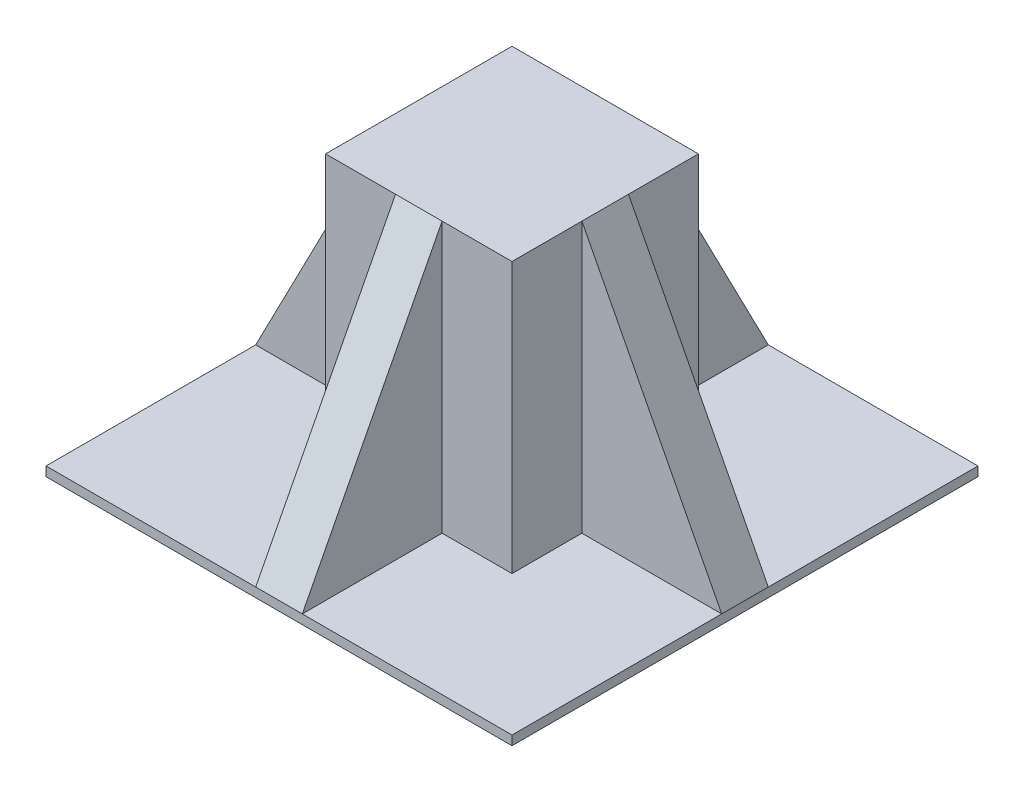
ISO-10303-21;
HEADER;
FILE_DESCRIPTION(('STEP AP214'),'2;1');
FILE_NAME('part.step','',(''),(''),'','','');
FILE_SCHEMA(('AUTOMOTIVE_DESIGN { 1 0 10303 214 1 1 1 1 }'));
ENDSEC;
DATA;
#1=APPLICATION_CONTEXT('core data for automotive mechanical design processes');
#2=APPLICATION_PROTOCOL_DEFINITION('international standard','automotive_design',2000,#1);
#3=PRODUCT_CONTEXT('',#1,'mechanical');
#4=PRODUCT('Part','Part','',(#3));
#5=PRODUCT_RELATED_PRODUCT_CATEGORY('part','',(#4));
#6=PRODUCT_DEFINITION_FORMATION('','',#4);
#7=PRODUCT_DEFINITION_CONTEXT('part definition',#1,'design');
#8=PRODUCT_DEFINITION('design','',#6,#7);
#9=PRODUCT_DEFINITION_SHAPE('','',#8);
#10=(LENGTH_UNIT() NAMED_UNIT(*) SI_UNIT(.MILLI.,.METRE.));
#11=(NAMED_UNIT(*) PLANE_ANGLE_UNIT() SI_UNIT($,.RADIAN.));
#12=(NAMED_UNIT(*) SI_UNIT($,.STERADIAN.) SOLID_ANGLE_UNIT());
#13=UNCERTAINTY_MEASURE_WITH_UNIT(LENGTH_MEASURE(1.E-05),#10,'distance_accuracy_value','');
#14=(GEOMETRIC_REPRESENTATION_CONTEXT(3) GLOBAL_UNCERTAINTY_ASSIGNED_CONTEXT((#13)) GLOBAL_UNIT_ASSIGNED_CONTEXT((#10,
#11,#12)) REPRESENTATION_CONTEXT('',''));
#15=CARTESIAN_POINT('',(0.,0.,0.));
#16=DIRECTION('',(0.,0.,1.));
#17=DIRECTION('',(1.,0.,0.));
#18=AXIS2_PLACEMENT_3D('',#15,#16,#17);
#19=CARTESIAN_POINT('',(0.,2.,0.));
#20=DIRECTION('',(0.,-1.,0.));
#21=DIRECTION('',(0.,0.,-1.));
#22=AXIS2_PLACEMENT_3D('',#19,#20,#21);
#23=PLANE('',#22);
#24=DIRECTION('',(1.,0.,0.));
#25=VECTOR('',#24,1.);
#26=CARTESIAN_POINT('',(-50.,2.,5.));
#27=LINE('',#26,#25);
#28=CARTESIAN_POINT('',(-50.,2.,5.));
#29=VERTEX_POINT('',#28);
#30=CARTESIAN_POINT('',(-20.,2.,5.));
#31=VERTEX_POINT('',#30);
#32=EDGE_CURVE('E61',#29,#31,#27,.T.);
#33=ORIENTED_EDGE('',*,*,#32,.F.);
#34=DIRECTION('',(0.,0.,1.));
#35=VECTOR('',#34,1.);
#36=CARTESIAN_POINT('',(-50.,2.,50.));
#37=LINE('',#36,#35);
#38=CARTESIAN_POINT('',(-50.,2.,50.));
#39=VERTEX_POINT('',#38);
#40=EDGE_CURVE('E244',#29,#39,#37,.T.);
#41=ORIENTED_EDGE('',*,*,#40,.T.);
#42=DIRECTION('',(1.,0.,0.));
#43=VECTOR('',#42,1.);
#44=CARTESIAN_POINT('',(-50.,2.,50.));
#45=LINE('',#44,#43);
#46=CARTESIAN_POINT('',(-5.,2.,50.));
#47=VERTEX_POINT('',#46);
#48=EDGE_CURVE('E249',#39,#47,#45,.T.);
#49=ORIENTED_EDGE('',*,*,#48,.T.);
#50=DIRECTION('',(0.,0.,-1.));
#51=VECTOR('',#50,1.);
#52=CARTESIAN_POINT('',(-5.,2.,20.));
#53=LINE('',#52,#51);
#54=CARTESIAN_POINT('',(-5.,2.,20.));
#55=VERTEX_POINT('',#54);
#56=EDGE_CURVE('E367',#47,#55,#53,.T.);
#57=ORIENTED_EDGE('',*,*,#56,.T.);
#58=DIRECTION('',(1.,0.,0.));
#59=VECTOR('',#58,1.);
#60=CARTESIAN_POINT('',(-20.,2.,20.));
#61=LINE('',#60,#59);
#62=CARTESIAN_POINT('',(-20.,2.,20.));
#63=VERTEX_POINT('',#62);
#64=EDGE_CURVE('E231',#63,#55,#61,.T.);
#65=ORIENTED_EDGE('',*,*,#64,.F.);
#66=DIRECTION('',(0.,0.,1.));
#67=VECTOR('',#66,1.);
#68=CARTESIAN_POINT('',(-20.,2.,20.));
#69=LINE('',#68,#67);
#70=EDGE_CURVE('E225',#31,#63,#69,.T.);
#71=ORIENTED_EDGE('',*,*,#70,.F.);
#72=EDGE_LOOP('',(#33,#41,#49,#57,#65,#71));
#73=FACE_BOUND('',#72,.T.);
#74=ADVANCED_FACE('F45',(#73),#23,.F.);
#75=DIRECTION('',(1.,0.,0.));
#76=VECTOR('',#75,1.);
#77=CARTESIAN_POINT('',(50.,2.,-5.));
#78=LINE('',#77,#76);
#79=CARTESIAN_POINT('',(20.,2.,-5.));
#80=VERTEX_POINT('',#79);
#81=CARTESIAN_POINT('',(50.,2.,-5.));
#82=VERTEX_POINT('',#81);
#83=EDGE_CURVE('E304',#80,#82,#78,.T.);
#84=ORIENTED_EDGE('',*,*,#83,.T.);
#85=DIRECTION('',(0.,0.,-1.));
#86=VECTOR('',#85,1.);
#87=CARTESIAN_POINT('',(50.,2.,50.));
#88=LINE('',#87,#86);
#89=CARTESIAN_POINT('',(50.,2.,-50.));
#90=VERTEX_POINT('',#89);
#91=EDGE_CURVE('E239',#82,#90,#88,.T.);
#92=ORIENTED_EDGE('',*,*,#91,.T.);
#93=DIRECTION('',(-1.,0.,0.));
#94=VECTOR('',#93,1.);
#95=CARTESIAN_POINT('',(-50.,2.,-50.));
#96=LINE('',#95,#94);
#97=CARTESIAN_POINT('',(5.,2.,-50.));
#98=VERTEX_POINT('',#97);
#99=EDGE_CURVE('E240',#90,#98,#96,.T.);
#100=ORIENTED_EDGE('',*,*,#99,.T.);
#101=DIRECTION('',(0.,0.,-1.));
#102=VECTOR('',#101,1.);
#103=CARTESIAN_POINT('',(5.,2.,-50.));
#104=LINE('',#103,#102);
#105=CARTESIAN_POINT('',(5.,2.,-20.));
#106=VERTEX_POINT('',#105);
#107=EDGE_CURVE('E336',#106,#98,#104,.T.);
#108=ORIENTED_EDGE('',*,*,#107,.F.);
#109=DIRECTION('',(-1.,0.,0.));
#110=VECTOR('',#109,1.);
#111=CARTESIAN_POINT('',(-20.,2.,-20.));
#112=LINE('',#111,#110);
#113=CARTESIAN_POINT('',(20.,2.,-20.));
#114=VERTEX_POINT('',#113);
#115=EDGE_CURVE('E218',#114,#106,#112,.T.);
#116=ORIENTED_EDGE('',*,*,#115,.F.);
#117=DIRECTION('',(0.,0.,-1.));
#118=VECTOR('',#117,1.);
#119=CARTESIAN_POINT('',(20.,2.,20.));
#120=LINE('',#119,#118);
#121=EDGE_CURVE('E214',#80,#114,#120,.T.);
#122=ORIENTED_EDGE('',*,*,#121,.F.);
#123=EDGE_LOOP('',(#84,#92,#100,#108,#116,#122));
#124=FACE_BOUND('',#123,.T.);
#125=ADVANCED_FACE('F434',(#124),#23,.F.);
#126=CARTESIAN_POINT('',(20.,60.,0.));
#127=DIRECTION('',(-1.,0.,0.));
#128=DIRECTION('',(0.,0.,1.));
#129=AXIS2_PLACEMENT_3D('',#126,#127,#128);
#130=PLANE('',#129);
#131=DIRECTION('',(0.,-1.,0.));
#132=VECTOR('',#131,1.);
#133=CARTESIAN_POINT('',(20.,2.,-5.));
#134=LINE('',#133,#132);
#135=CARTESIAN_POINT('',(20.,60.,-5.));
#136=VERTEX_POINT('',#135);
#137=EDGE_CURVE('E431',#136,#80,#134,.T.);
#138=ORIENTED_EDGE('',*,*,#137,.T.);
#139=ORIENTED_EDGE('',*,*,#121,.T.);
#140=DIRECTION('',(0.,-1.,0.));
#141=VECTOR('',#140,1.);
#142=CARTESIAN_POINT('',(20.,60.,-20.));
#143=LINE('',#142,#141);
#144=CARTESIAN_POINT('',(20.,60.,-20.));
#145=VERTEX_POINT('',#144);
#146=EDGE_CURVE('E414',#145,#114,#143,.T.);
#147=ORIENTED_EDGE('',*,*,#146,.F.);
#148=DIRECTION('',(0.,0.,-1.));
#149=VECTOR('',#148,1.);
#150=CARTESIAN_POINT('',(20.,60.,0.));
#151=LINE('',#150,#149);
#152=EDGE_CURVE('E393',#136,#145,#151,.T.);
#153=ORIENTED_EDGE('',*,*,#152,.F.);
#154=EDGE_LOOP('',(#138,#139,#147,#153));
#155=FACE_BOUND('',#154,.T.);
#156=ADVANCED_FACE('F427',(#155),#130,.F.);
#157=CARTESIAN_POINT('',(-20.,60.,0.));
#158=DIRECTION('',(-1.,0.,0.));
#159=DIRECTION('',(0.,0.,1.));
#160=AXIS2_PLACEMENT_3D('',#157,#158,#159);
#161=PLANE('',#160);
#162=DIRECTION('',(0.,0.,-1.));
#163=VECTOR('',#162,1.);
#164=CARTESIAN_POINT('',(-20.,60.,0.));
#165=LINE('',#164,#163);
#166=CARTESIAN_POINT('',(-20.,60.,20.));
#167=VERTEX_POINT('',#166);
#168=CARTESIAN_POINT('',(-20.,60.,5.));
#169=VERTEX_POINT('',#168);
#170=EDGE_CURVE('E403',#167,#169,#165,.T.);
#171=ORIENTED_EDGE('',*,*,#170,.T.);
#172=DIRECTION('',(0.,1.,0.));
#173=VECTOR('',#172,1.);
#174=CARTESIAN_POINT('',(-20.,2.,5.));
#175=LINE('',#174,#173);
#176=EDGE_CURVE('E196',#31,#169,#175,.T.);
#177=ORIENTED_EDGE('',*,*,#176,.F.);
#178=ORIENTED_EDGE('',*,*,#70,.T.);
#179=DIRECTION('',(0.,-1.,0.));
#180=VECTOR('',#179,1.);
#181=CARTESIAN_POINT('',(-20.,60.,20.));
#182=LINE('',#181,#180);
#183=EDGE_CURVE('E407',#167,#63,#182,.T.);
#184=ORIENTED_EDGE('',*,*,#183,.F.);
#185=EDGE_LOOP('',(#171,#177,#178,#184));
#186=FACE_BOUND('',#185,.T.);
#187=ADVANCED_FACE('F465',(#186),#161,.T.);
#188=CARTESIAN_POINT('',(-50.,2.,-50.));
#189=VERTEX_POINT('',#188);
#190=CARTESIAN_POINT('',(-50.,2.,-5.));
#191=VERTEX_POINT('',#190);
#192=EDGE_CURVE('E245',#189,#191,#37,.T.);
#193=ORIENTED_EDGE('',*,*,#192,.T.);
#194=DIRECTION('',(1.,0.,0.));
#195=VECTOR('',#194,1.);
#196=CARTESIAN_POINT('',(-50.,2.,-5.));
#197=LINE('',#196,#195);
#198=CARTESIAN_POINT('',(-20.,2.,-5.));
#199=VERTEX_POINT('',#198);
#200=EDGE_CURVE('E310',#191,#199,#197,.T.);
#201=ORIENTED_EDGE('',*,*,#200,.T.);
#202=CARTESIAN_POINT('',(-20.,2.,-20.));
#203=VERTEX_POINT('',#202);
#204=EDGE_CURVE('E226',#203,#199,#69,.T.);
#205=ORIENTED_EDGE('',*,*,#204,.F.);
#206=CARTESIAN_POINT('',(-5.,2.,-20.));
#207=VERTEX_POINT('',#206);
#208=EDGE_CURVE('E213',#207,#203,#112,.T.);
#209=ORIENTED_EDGE('',*,*,#208,.F.);
#210=DIRECTION('',(0.,0.,-1.));
#211=VECTOR('',#210,1.);
#212=CARTESIAN_POINT('',(-5.,2.,-50.));
#213=LINE('',#212,#211);
#214=CARTESIAN_POINT('',(-5.,2.,-50.));
#215=VERTEX_POINT('',#214);
#216=EDGE_CURVE('E348',#207,#215,#213,.T.);
#217=ORIENTED_EDGE('',*,*,#216,.T.);
#218=EDGE_CURVE('E238',#215,#189,#96,.T.);
#219=ORIENTED_EDGE('',*,*,#218,.T.);
#220=EDGE_LOOP('',(#193,#201,#205,#209,#217,#219));
#221=FACE_BOUND('',#220,.T.);
#222=ADVANCED_FACE('F455',(#221),#23,.F.);
#223=CARTESIAN_POINT('',(0.,60.,20.));
#224=DIRECTION('',(0.,0.,-1.));
#225=DIRECTION('',(-1.,0.,0.));
#226=AXIS2_PLACEMENT_3D('',#223,#224,#225);
#227=PLANE('',#226);
#228=DIRECTION('',(0.,1.,0.));
#229=VECTOR('',#228,1.);
#230=CARTESIAN_POINT('',(5.,60.,20.));
#231=LINE('',#230,#229);
#232=CARTESIAN_POINT('',(5.,2.,20.));
#233=VERTEX_POINT('',#232);
#234=CARTESIAN_POINT('',(5.,60.,20.));
#235=VERTEX_POINT('',#234);
#236=EDGE_CURVE('E337',#233,#235,#231,.T.);
#237=ORIENTED_EDGE('',*,*,#236,.F.);
#238=CARTESIAN_POINT('',(20.,2.,20.));
#239=VERTEX_POINT('',#238);
#240=EDGE_CURVE('E230',#233,#239,#61,.T.);
#241=ORIENTED_EDGE('',*,*,#240,.T.);
#242=DIRECTION('',(0.,-1.,0.));
#243=VECTOR('',#242,1.);
#244=CARTESIAN_POINT('',(20.,60.,20.));
#245=LINE('',#244,#243);
#246=CARTESIAN_POINT('',(20.,60.,20.));
#247=VERTEX_POINT('',#246);
#248=EDGE_CURVE('E211',#247,#239,#245,.T.);
#249=ORIENTED_EDGE('',*,*,#248,.F.);
#250=DIRECTION('',(1.,0.,0.));
#251=VECTOR('',#250,1.);
#252=CARTESIAN_POINT('',(0.,60.,20.));
#253=LINE('',#252,#251);
#254=EDGE_CURVE('E360',#235,#247,#253,.T.);
#255=ORIENTED_EDGE('',*,*,#254,.F.);
#256=EDGE_LOOP('',(#237,#241,#249,#255));
#257=FACE_BOUND('',#256,.T.);
#258=ADVANCED_FACE('F506',(#257),#227,.F.);
#259=CARTESIAN_POINT('',(0.,60.,-20.));
#260=DIRECTION('',(0.,0.,-1.));
#261=DIRECTION('',(-1.,0.,0.));
#262=AXIS2_PLACEMENT_3D('',#259,#260,#261);
#263=PLANE('',#262);
#264=DIRECTION('',(1.,0.,0.));
#265=VECTOR('',#264,1.);
#266=CARTESIAN_POINT('',(0.,60.,-20.));
#267=LINE('',#266,#265);
#268=CARTESIAN_POINT('',(-20.,60.,-20.));
#269=VERTEX_POINT('',#268);
#270=CARTESIAN_POINT('',(-5.,60.,-20.));
#271=VERTEX_POINT('',#270);
#272=EDGE_CURVE('E398',#269,#271,#267,.T.);
#273=ORIENTED_EDGE('',*,*,#272,.T.);
#274=DIRECTION('',(0.,-1.,0.));
#275=VECTOR('',#274,1.);
#276=CARTESIAN_POINT('',(-5.,2.,-20.));
#277=LINE('',#276,#275);
#278=EDGE_CURVE('E345',#271,#207,#277,.T.);
#279=ORIENTED_EDGE('',*,*,#278,.T.);
#280=ORIENTED_EDGE('',*,*,#208,.T.);
#281=DIRECTION('',(0.,-1.,0.));
#282=VECTOR('',#281,1.);
#283=CARTESIAN_POINT('',(-20.,60.,-20.));
#284=LINE('',#283,#282);
#285=EDGE_CURVE('E411',#269,#203,#284,.T.);
#286=ORIENTED_EDGE('',*,*,#285,.F.);
#287=EDGE_LOOP('',(#273,#279,#280,#286));
#288=FACE_BOUND('',#287,.T.);
#289=ADVANCED_FACE('F449',(#288),#263,.T.);
#290=CARTESIAN_POINT('',(50.,2.,50.));
#291=VERTEX_POINT('',#290);
#292=CARTESIAN_POINT('',(50.,2.,5.));
#293=VERTEX_POINT('',#292);
#294=EDGE_CURVE('E206',#291,#293,#88,.T.);
#295=ORIENTED_EDGE('',*,*,#294,.T.);
#296=DIRECTION('',(1.,0.,0.));
#297=VECTOR('',#296,1.);
#298=CARTESIAN_POINT('',(50.,2.,5.));
#299=LINE('',#298,#297);
#300=CARTESIAN_POINT('',(20.,2.,5.));
#301=VERTEX_POINT('',#300);
#302=EDGE_CURVE('E188',#301,#293,#299,.T.);
#303=ORIENTED_EDGE('',*,*,#302,.F.);
#304=EDGE_CURVE('E203',#239,#301,#120,.T.);
#305=ORIENTED_EDGE('',*,*,#304,.F.);
#306=ORIENTED_EDGE('',*,*,#240,.F.);
#307=DIRECTION('',(0.,0.,-1.));
#308=VECTOR('',#307,1.);
#309=CARTESIAN_POINT('',(5.,2.,20.));
#310=LINE('',#309,#308);
#311=CARTESIAN_POINT('',(5.,2.,50.));
#312=VERTEX_POINT('',#311);
#313=EDGE_CURVE('E380',#312,#233,#310,.T.);
#314=ORIENTED_EDGE('',*,*,#313,.F.);
#315=EDGE_CURVE('E248',#312,#291,#45,.T.);
#316=ORIENTED_EDGE('',*,*,#315,.T.);
#317=EDGE_LOOP('',(#295,#303,#305,#306,#314,#316));
#318=FACE_BOUND('',#317,.T.);
#319=ADVANCED_FACE('F201',(#318),#23,.F.);
#320=CARTESIAN_POINT('',(0.,0.,0.));
#321=DIRECTION('',(0.,-1.,0.));
#322=DIRECTION('',(0.,0.,-1.));
#323=AXIS2_PLACEMENT_3D('',#320,#321,#322);
#324=PLANE('',#323);
#325=DIRECTION('',(0.,0.,-1.));
#326=VECTOR('',#325,1.);
#327=CARTESIAN_POINT('',(50.,0.,50.));
#328=LINE('',#327,#326);
#329=CARTESIAN_POINT('',(50.,0.,50.));
#330=VERTEX_POINT('',#329);
#331=CARTESIAN_POINT('',(50.,0.,-50.));
#332=VERTEX_POINT('',#331);
#333=EDGE_CURVE('E235',#330,#332,#328,.T.);
#334=ORIENTED_EDGE('',*,*,#333,.F.);
#335=DIRECTION('',(1.,0.,0.));
#336=VECTOR('',#335,1.);
#337=CARTESIAN_POINT('',(-50.,0.,50.));
#338=LINE('',#337,#336);
#339=CARTESIAN_POINT('',(-50.,0.,50.));
#340=VERTEX_POINT('',#339);
#341=EDGE_CURVE('E263',#340,#330,#338,.T.);
#342=ORIENTED_EDGE('',*,*,#341,.F.);
#343=DIRECTION('',(0.,0.,1.));
#344=VECTOR('',#343,1.);
#345=CARTESIAN_POINT('',(-50.,0.,50.));
#346=LINE('',#345,#344);
#347=CARTESIAN_POINT('',(-50.,0.,-50.));
#348=VERTEX_POINT('',#347);
#349=EDGE_CURVE('E260',#348,#340,#346,.T.);
#350=ORIENTED_EDGE('',*,*,#349,.F.);
#351=DIRECTION('',(-1.,0.,0.));
#352=VECTOR('',#351,1.);
#353=CARTESIAN_POINT('',(-50.,0.,-50.));
#354=LINE('',#353,#352);
#355=EDGE_CURVE('E257',#332,#348,#354,.T.);
#356=ORIENTED_EDGE('',*,*,#355,.F.);
#357=EDGE_LOOP('',(#334,#342,#350,#356));
#358=FACE_BOUND('',#357,.T.);
#359=ADVANCED_FACE('F283',(#358),#324,.T.);
#360=CARTESIAN_POINT('',(50.,2.,50.));
#361=DIRECTION('',(-1.,0.,0.));
#362=DIRECTION('',(0.,0.,1.));
#363=AXIS2_PLACEMENT_3D('',#360,#361,#362);
#364=PLANE('',#363);
#365=ORIENTED_EDGE('',*,*,#333,.T.);
#366=DIRECTION('',(0.,-1.,0.));
#367=VECTOR('',#366,1.);
#368=CARTESIAN_POINT('',(50.,2.,-50.));
#369=LINE('',#368,#367);
#370=EDGE_CURVE('E11',#90,#332,#369,.T.);
#371=ORIENTED_EDGE('',*,*,#370,.F.);
#372=ORIENTED_EDGE('',*,*,#91,.F.);
#373=DIRECTION('',(0.,0.,1.));
#374=VECTOR('',#373,1.);
#375=CARTESIAN_POINT('',(50.,2.,-5.));
#376=LINE('',#375,#374);
#377=EDGE_CURVE('E293',#82,#293,#376,.T.);
#378=ORIENTED_EDGE('',*,*,#377,.T.);
#379=ORIENTED_EDGE('',*,*,#294,.F.);
#380=DIRECTION('',(0.,-1.,0.));
#381=VECTOR('',#380,1.);
#382=CARTESIAN_POINT('',(50.,2.,50.));
#383=LINE('',#382,#381);
#384=EDGE_CURVE('E253',#291,#330,#383,.T.);
#385=ORIENTED_EDGE('',*,*,#384,.T.);
#386=EDGE_LOOP('',(#365,#371,#372,#378,#379,#385));
#387=FACE_BOUND('',#386,.T.);
#388=ADVANCED_FACE('F47',(#387),#364,.F.);
#389=CARTESIAN_POINT('',(-50.,2.,-50.));
#390=DIRECTION('',(0.,0.,1.));
#391=DIRECTION('',(1.,0.,0.));
#392=AXIS2_PLACEMENT_3D('',#389,#390,#391);
#393=PLANE('',#392);
#394=ORIENTED_EDGE('',*,*,#355,.T.);
#395=DIRECTION('',(0.,-1.,0.));
#396=VECTOR('',#395,1.);
#397=CARTESIAN_POINT('',(-50.,2.,-50.));
#398=LINE('',#397,#396);
#399=EDGE_CURVE('E54',#189,#348,#398,.T.);
#400=ORIENTED_EDGE('',*,*,#399,.F.);
#401=ORIENTED_EDGE('',*,*,#218,.F.);
#402=DIRECTION('',(1.,0.,0.));
#403=VECTOR('',#402,1.);
#404=CARTESIAN_POINT('',(-5.,2.,-50.));
#405=LINE('',#404,#403);
#406=EDGE_CURVE('E355',#215,#98,#405,.T.);
#407=ORIENTED_EDGE('',*,*,#406,.T.);
#408=ORIENTED_EDGE('',*,*,#99,.F.);
#409=ORIENTED_EDGE('',*,*,#370,.T.);
#410=EDGE_LOOP('',(#394,#400,#401,#407,#408,#409));
#411=FACE_BOUND('',#410,.T.);
#412=ADVANCED_FACE('F457',(#411),#393,.F.);
#413=CARTESIAN_POINT('',(-50.,2.,50.));
#414=DIRECTION('',(1.,0.,0.));
#415=DIRECTION('',(0.,0.,-1.));
#416=AXIS2_PLACEMENT_3D('',#413,#414,#415);
#417=PLANE('',#416);
#418=ORIENTED_EDGE('',*,*,#349,.T.);
#419=DIRECTION('',(0.,-1.,0.));
#420=VECTOR('',#419,1.);
#421=CARTESIAN_POINT('',(-50.,2.,50.));
#422=LINE('',#421,#420);
#423=EDGE_CURVE('E269',#39,#340,#422,.T.);
#424=ORIENTED_EDGE('',*,*,#423,.F.);
#425=ORIENTED_EDGE('',*,*,#40,.F.);
#426=DIRECTION('',(0.,0.,1.));
#427=VECTOR('',#426,1.);
#428=CARTESIAN_POINT('',(-50.,2.,-5.));
#429=LINE('',#428,#427);
#430=EDGE_CURVE('E68',#191,#29,#429,.T.);
#431=ORIENTED_EDGE('',*,*,#430,.F.);
#432=ORIENTED_EDGE('',*,*,#192,.F.);
#433=ORIENTED_EDGE('',*,*,#399,.T.);
#434=EDGE_LOOP('',(#418,#424,#425,#431,#432,#433));
#435=FACE_BOUND('',#434,.T.);
#436=ADVANCED_FACE('F276',(#435),#417,.F.);
#437=CARTESIAN_POINT('',(-50.,2.,50.));
#438=DIRECTION('',(0.,0.,-1.));
#439=DIRECTION('',(-1.,0.,0.));
#440=AXIS2_PLACEMENT_3D('',#437,#438,#439);
#441=PLANE('',#440);
#442=ORIENTED_EDGE('',*,*,#341,.T.);
#443=ORIENTED_EDGE('',*,*,#384,.F.);
#444=ORIENTED_EDGE('',*,*,#315,.F.);
#445=DIRECTION('',(1.,0.,0.));
#446=VECTOR('',#445,1.);
#447=CARTESIAN_POINT('',(-5.,2.,50.));
#448=LINE('',#447,#446);
#449=EDGE_CURVE('E302',#47,#312,#448,.T.);
#450=ORIENTED_EDGE('',*,*,#449,.F.);
#451=ORIENTED_EDGE('',*,*,#48,.F.);
#452=ORIENTED_EDGE('',*,*,#423,.T.);
#453=EDGE_LOOP('',(#442,#443,#444,#450,#451,#452));
#454=FACE_BOUND('',#453,.T.);
#455=ADVANCED_FACE('F286',(#454),#441,.F.);
#456=ORIENTED_EDGE('',*,*,#64,.T.);
#457=DIRECTION('',(0.,1.,0.));
#458=VECTOR('',#457,1.);
#459=CARTESIAN_POINT('',(-5.,60.,20.));
#460=LINE('',#459,#458);
#461=CARTESIAN_POINT('',(-5.,60.,20.));
#462=VERTEX_POINT('',#461);
#463=EDGE_CURVE('E376',#55,#462,#460,.T.);
#464=ORIENTED_EDGE('',*,*,#463,.T.);
#465=EDGE_CURVE('E389',#167,#462,#253,.T.);
#466=ORIENTED_EDGE('',*,*,#465,.F.);
#467=ORIENTED_EDGE('',*,*,#183,.T.);
#468=EDGE_LOOP('',(#456,#464,#466,#467));
#469=FACE_BOUND('',#468,.T.);
#470=ADVANCED_FACE('F469',(#469),#227,.F.);
#471=DIRECTION('',(0.,-1.,0.));
#472=VECTOR('',#471,1.);
#473=CARTESIAN_POINT('',(5.,2.,-20.));
#474=LINE('',#473,#472);
#475=CARTESIAN_POINT('',(5.,60.,-20.));
#476=VERTEX_POINT('',#475);
#477=EDGE_CURVE('E332',#476,#106,#474,.T.);
#478=ORIENTED_EDGE('',*,*,#477,.F.);
#479=EDGE_CURVE('E397',#476,#145,#267,.T.);
#480=ORIENTED_EDGE('',*,*,#479,.T.);
#481=ORIENTED_EDGE('',*,*,#146,.T.);
#482=ORIENTED_EDGE('',*,*,#115,.T.);
#483=EDGE_LOOP('',(#478,#480,#481,#482));
#484=FACE_BOUND('',#483,.T.);
#485=ADVANCED_FACE('F422',(#484),#263,.T.);
#486=ORIENTED_EDGE('',*,*,#304,.T.);
#487=DIRECTION('',(0.,-1.,0.));
#488=VECTOR('',#487,1.);
#489=CARTESIAN_POINT('',(20.,2.,5.));
#490=LINE('',#489,#488);
#491=CARTESIAN_POINT('',(20.,60.,5.));
#492=VERTEX_POINT('',#491);
#493=EDGE_CURVE('E185',#492,#301,#490,.T.);
#494=ORIENTED_EDGE('',*,*,#493,.F.);
#495=EDGE_CURVE('E394',#247,#492,#151,.T.);
#496=ORIENTED_EDGE('',*,*,#495,.F.);
#497=ORIENTED_EDGE('',*,*,#248,.T.);
#498=EDGE_LOOP('',(#486,#494,#496,#497));
#499=FACE_BOUND('',#498,.T.);
#500=ADVANCED_FACE('F209',(#499),#130,.F.);
#501=DIRECTION('',(0.,1.,0.));
#502=VECTOR('',#501,1.);
#503=CARTESIAN_POINT('',(-20.,2.,-5.));
#504=LINE('',#503,#502);
#505=CARTESIAN_POINT('',(-20.,60.,-5.));
#506=VERTEX_POINT('',#505);
#507=EDGE_CURVE('E319',#199,#506,#504,.T.);
#508=ORIENTED_EDGE('',*,*,#507,.T.);
#509=EDGE_CURVE('E402',#506,#269,#165,.T.);
#510=ORIENTED_EDGE('',*,*,#509,.T.);
#511=ORIENTED_EDGE('',*,*,#285,.T.);
#512=ORIENTED_EDGE('',*,*,#204,.T.);
#513=EDGE_LOOP('',(#508,#510,#511,#512));
#514=FACE_BOUND('',#513,.T.);
#515=ADVANCED_FACE('F514',(#514),#161,.T.);
#516=CARTESIAN_POINT('',(0.,60.,0.));
#517=DIRECTION('',(0.,1.,0.));
#518=DIRECTION('',(0.,0.,1.));
#519=AXIS2_PLACEMENT_3D('',#516,#517,#518);
#520=PLANE('',#519);
#521=ORIENTED_EDGE('',*,*,#465,.T.);
#522=DIRECTION('',(1.,0.,0.));
#523=VECTOR('',#522,1.);
#524=CARTESIAN_POINT('',(-5.,60.,20.));
#525=LINE('',#524,#523);
#526=EDGE_CURVE('E363',#462,#235,#525,.T.);
#527=ORIENTED_EDGE('',*,*,#526,.T.);
#528=ORIENTED_EDGE('',*,*,#254,.T.);
#529=ORIENTED_EDGE('',*,*,#495,.T.);
#530=DIRECTION('',(0.,0.,1.));
#531=VECTOR('',#530,1.);
#532=CARTESIAN_POINT('',(20.,60.,-5.));
#533=LINE('',#532,#531);
#534=EDGE_CURVE('E297',#136,#492,#533,.T.);
#535=ORIENTED_EDGE('',*,*,#534,.F.);
#536=ORIENTED_EDGE('',*,*,#152,.T.);
#537=ORIENTED_EDGE('',*,*,#479,.F.);
#538=DIRECTION('',(1.,0.,0.));
#539=VECTOR('',#538,1.);
#540=CARTESIAN_POINT('',(-5.,60.,-20.));
#541=LINE('',#540,#539);
#542=EDGE_CURVE('E356',#271,#476,#541,.T.);
#543=ORIENTED_EDGE('',*,*,#542,.F.);
#544=ORIENTED_EDGE('',*,*,#272,.F.);
#545=ORIENTED_EDGE('',*,*,#509,.F.);
#546=DIRECTION('',(0.,0.,1.));
#547=VECTOR('',#546,1.);
#548=CARTESIAN_POINT('',(-20.,60.,-5.));
#549=LINE('',#548,#547);
#550=EDGE_CURVE('E307',#506,#169,#549,.T.);
#551=ORIENTED_EDGE('',*,*,#550,.T.);
#552=ORIENTED_EDGE('',*,*,#170,.F.);
#553=EDGE_LOOP('',(#521,#527,#528,#529,#535,#536,#537,#543,#544,#545,#551,#552));
#554=FACE_BOUND('',#553,.T.);
#555=ADVANCED_FACE('F445',(#554),#520,.T.);
#556=CARTESIAN_POINT('',(-5.,2.,50.));
#557=DIRECTION('',(0.,0.459422918873767,0.888217643155949));
#558=DIRECTION('',(0.,-0.888217643155949,0.459422918873767));
#559=AXIS2_PLACEMENT_3D('',#556,#557,#558);
#560=PLANE('',#559);
#561=ORIENTED_EDGE('',*,*,#449,.T.);
#562=DIRECTION('',(0.,-0.888217643155949,0.459422918873767));
#563=VECTOR('',#562,1.);
#564=CARTESIAN_POINT('',(5.,2.,50.));
#565=LINE('',#564,#563);
#566=EDGE_CURVE('E383',#235,#312,#565,.T.);
#567=ORIENTED_EDGE('',*,*,#566,.F.);
#568=ORIENTED_EDGE('',*,*,#526,.F.);
#569=DIRECTION('',(0.,-0.888217643155949,0.459422918873767));
#570=VECTOR('',#569,1.);
#571=CARTESIAN_POINT('',(-5.,2.,50.));
#572=LINE('',#571,#570);
#573=EDGE_CURVE('E373',#462,#47,#572,.T.);
#574=ORIENTED_EDGE('',*,*,#573,.T.);
#575=EDGE_LOOP('',(#561,#567,#568,#574));
#576=FACE_BOUND('',#575,.T.);
#577=ADVANCED_FACE('F526',(#576),#560,.T.);
#578=CARTESIAN_POINT('',(-5.,0.,0.));
#579=DIRECTION('',(-1.,0.,0.));
#580=DIRECTION('',(0.,0.,1.));
#581=AXIS2_PLACEMENT_3D('',#578,#579,#580);
#582=PLANE('',#581);
#583=ORIENTED_EDGE('',*,*,#463,.F.);
#584=ORIENTED_EDGE('',*,*,#56,.F.);
#585=ORIENTED_EDGE('',*,*,#573,.F.);
#586=EDGE_LOOP('',(#583,#584,#585));
#587=FACE_BOUND('',#586,.T.);
#588=ADVANCED_FACE('F544',(#587),#582,.T.);
#589=CARTESIAN_POINT('',(5.,0.,0.));
#590=DIRECTION('',(-1.,0.,0.));
#591=DIRECTION('',(0.,0.,1.));
#592=AXIS2_PLACEMENT_3D('',#589,#590,#591);
#593=PLANE('',#592);
#594=ORIENTED_EDGE('',*,*,#236,.T.);
#595=ORIENTED_EDGE('',*,*,#566,.T.);
#596=ORIENTED_EDGE('',*,*,#313,.T.);
#597=EDGE_LOOP('',(#594,#595,#596));
#598=FACE_BOUND('',#597,.T.);
#599=ADVANCED_FACE('F542',(#598),#593,.F.);
#600=CARTESIAN_POINT('',(-5.,60.,-20.));
#601=DIRECTION('',(0.,0.459422918873767,-0.888217643155949));
#602=DIRECTION('',(0.,0.888217643155949,0.459422918873767));
#603=AXIS2_PLACEMENT_3D('',#600,#601,#602);
#604=PLANE('',#603);
#605=ORIENTED_EDGE('',*,*,#542,.T.);
#606=DIRECTION('',(0.,0.888217643155949,0.459422918873767));
#607=VECTOR('',#606,1.);
#608=CARTESIAN_POINT('',(5.,60.,-20.));
#609=LINE('',#608,#607);
#610=EDGE_CURVE('E341',#98,#476,#609,.T.);
#611=ORIENTED_EDGE('',*,*,#610,.F.);
#612=ORIENTED_EDGE('',*,*,#406,.F.);
#613=DIRECTION('',(0.,0.888217643155949,0.459422918873767));
#614=VECTOR('',#613,1.);
#615=CARTESIAN_POINT('',(-5.,60.,-20.));
#616=LINE('',#615,#614);
#617=EDGE_CURVE('E351',#215,#271,#616,.T.);
#618=ORIENTED_EDGE('',*,*,#617,.T.);
#619=EDGE_LOOP('',(#605,#611,#612,#618));
#620=FACE_BOUND('',#619,.T.);
#621=ADVANCED_FACE('F441',(#620),#604,.T.);
#622=CARTESIAN_POINT('',(-5.,0.,0.));
#623=DIRECTION('',(1.,0.,0.));
#624=DIRECTION('',(0.,0.,-1.));
#625=AXIS2_PLACEMENT_3D('',#622,#623,#624);
#626=PLANE('',#625);
#627=ORIENTED_EDGE('',*,*,#278,.F.);
#628=ORIENTED_EDGE('',*,*,#617,.F.);
#629=ORIENTED_EDGE('',*,*,#216,.F.);
#630=EDGE_LOOP('',(#627,#628,#629));
#631=FACE_BOUND('',#630,.T.);
#632=ADVANCED_FACE('F453',(#631),#626,.F.);
#633=CARTESIAN_POINT('',(5.,0.,0.));
#634=DIRECTION('',(1.,0.,0.));
#635=DIRECTION('',(0.,0.,-1.));
#636=AXIS2_PLACEMENT_3D('',#633,#634,#635);
#637=PLANE('',#636);
#638=ORIENTED_EDGE('',*,*,#477,.T.);
#639=ORIENTED_EDGE('',*,*,#107,.T.);
#640=ORIENTED_EDGE('',*,*,#610,.T.);
#641=EDGE_LOOP('',(#638,#639,#640));
#642=FACE_BOUND('',#641,.T.);
#643=ADVANCED_FACE('F438',(#642),#637,.T.);
#644=CARTESIAN_POINT('',(-20.,60.,-5.));
#645=DIRECTION('',(-0.888217643155949,0.459422918873767,0.));
#646=DIRECTION('',(-0.459422918873767,-0.888217643155949,0.));
#647=AXIS2_PLACEMENT_3D('',#644,#645,#646);
#648=PLANE('',#647);
#649=ORIENTED_EDGE('',*,*,#430,.T.);
#650=DIRECTION('',(-0.459422918873766,-0.888217643155949,0.));
#651=VECTOR('',#650,1.);
#652=CARTESIAN_POINT('',(-20.,60.,5.));
#653=LINE('',#652,#651);
#654=EDGE_CURVE('E325',#169,#29,#653,.T.);
#655=ORIENTED_EDGE('',*,*,#654,.F.);
#656=ORIENTED_EDGE('',*,*,#550,.F.);
#657=DIRECTION('',(-0.459422918873766,-0.888217643155949,0.));
#658=VECTOR('',#657,1.);
#659=CARTESIAN_POINT('',(-20.,60.,-5.));
#660=LINE('',#659,#658);
#661=EDGE_CURVE('E315',#506,#191,#660,.T.);
#662=ORIENTED_EDGE('',*,*,#661,.T.);
#663=EDGE_LOOP('',(#649,#655,#656,#662));
#664=FACE_BOUND('',#663,.T.);
#665=ADVANCED_FACE('F474',(#664),#648,.T.);
#666=CARTESIAN_POINT('',(0.,0.,-5.));
#667=DIRECTION('',(0.,0.,-1.));
#668=DIRECTION('',(-1.,0.,0.));
#669=AXIS2_PLACEMENT_3D('',#666,#667,#668);
#670=PLANE('',#669);
#671=ORIENTED_EDGE('',*,*,#507,.F.);
#672=ORIENTED_EDGE('',*,*,#200,.F.);
#673=ORIENTED_EDGE('',*,*,#661,.F.);
#674=EDGE_LOOP('',(#671,#672,#673));
#675=FACE_BOUND('',#674,.T.);
#676=ADVANCED_FACE('F480',(#675),#670,.T.);
#677=CARTESIAN_POINT('',(0.,0.,5.));
#678=DIRECTION('',(0.,0.,-1.));
#679=DIRECTION('',(-1.,0.,0.));
#680=AXIS2_PLACEMENT_3D('',#677,#678,#679);
#681=PLANE('',#680);
#682=ORIENTED_EDGE('',*,*,#176,.T.);
#683=ORIENTED_EDGE('',*,*,#654,.T.);
#684=ORIENTED_EDGE('',*,*,#32,.T.);
#685=EDGE_LOOP('',(#682,#683,#684));
#686=FACE_BOUND('',#685,.T.);
#687=ADVANCED_FACE('F477',(#686),#681,.F.);
#688=CARTESIAN_POINT('',(20.,60.,-5.));
#689=DIRECTION('',(0.888217643155949,0.459422918873767,0.));
#690=DIRECTION('',(-0.459422918873767,0.888217643155949,0.));
#691=AXIS2_PLACEMENT_3D('',#688,#689,#690);
#692=PLANE('',#691);
#693=ORIENTED_EDGE('',*,*,#534,.T.);
#694=DIRECTION('',(-0.459422918873767,0.888217643155949,0.));
#695=VECTOR('',#694,1.);
#696=CARTESIAN_POINT('',(20.,60.,5.));
#697=LINE('',#696,#695);
#698=EDGE_CURVE('E190',#293,#492,#697,.T.);
#699=ORIENTED_EDGE('',*,*,#698,.F.);
#700=ORIENTED_EDGE('',*,*,#377,.F.);
#701=DIRECTION('',(-0.459422918873767,0.888217643155949,0.));
#702=VECTOR('',#701,1.);
#703=CARTESIAN_POINT('',(20.,60.,-5.));
#704=LINE('',#703,#702);
#705=EDGE_CURVE('E298',#82,#136,#704,.T.);
#706=ORIENTED_EDGE('',*,*,#705,.T.);
#707=EDGE_LOOP('',(#693,#699,#700,#706));
#708=FACE_BOUND('',#707,.T.);
#709=ADVANCED_FACE('F479',(#708),#692,.T.);
#710=CARTESIAN_POINT('',(0.,0.,-5.));
#711=DIRECTION('',(0.,0.,1.));
#712=DIRECTION('',(1.,0.,0.));
#713=AXIS2_PLACEMENT_3D('',#710,#711,#712);
#714=PLANE('',#713);
#715=ORIENTED_EDGE('',*,*,#137,.F.);
#716=ORIENTED_EDGE('',*,*,#705,.F.);
#717=ORIENTED_EDGE('',*,*,#83,.F.);
#718=EDGE_LOOP('',(#715,#716,#717));
#719=FACE_BOUND('',#718,.T.);
#720=ADVANCED_FACE('F486',(#719),#714,.F.);
#721=CARTESIAN_POINT('',(0.,0.,5.));
#722=DIRECTION('',(0.,0.,1.));
#723=DIRECTION('',(1.,0.,0.));
#724=AXIS2_PLACEMENT_3D('',#721,#722,#723);
#725=PLANE('',#724);
#726=ORIENTED_EDGE('',*,*,#493,.T.);
#727=ORIENTED_EDGE('',*,*,#302,.T.);
#728=ORIENTED_EDGE('',*,*,#698,.T.);
#729=EDGE_LOOP('',(#726,#727,#728));
#730=FACE_BOUND('',#729,.T.);
#731=ADVANCED_FACE('F187',(#730),#725,.T.);
#732=CLOSED_SHELL('',(#74,#125,#156,#187,#222,#258,#289,#319,#359,#388,#412,#436,#455,#470,#485,
#500,#515,#555,#577,#588,#599,#621,#632,#643,#665,#676,#687,#709,#720,#731));
#733=MANIFOLD_SOLID_BREP('B2',#732);
#734=ADVANCED_BREP_SHAPE_REPRESENTATION('',(#18,#733),#14);
#735=SHAPE_DEFINITION_REPRESENTATION(#9,#734);
ENDSEC;
END-ISO-10303-21;
